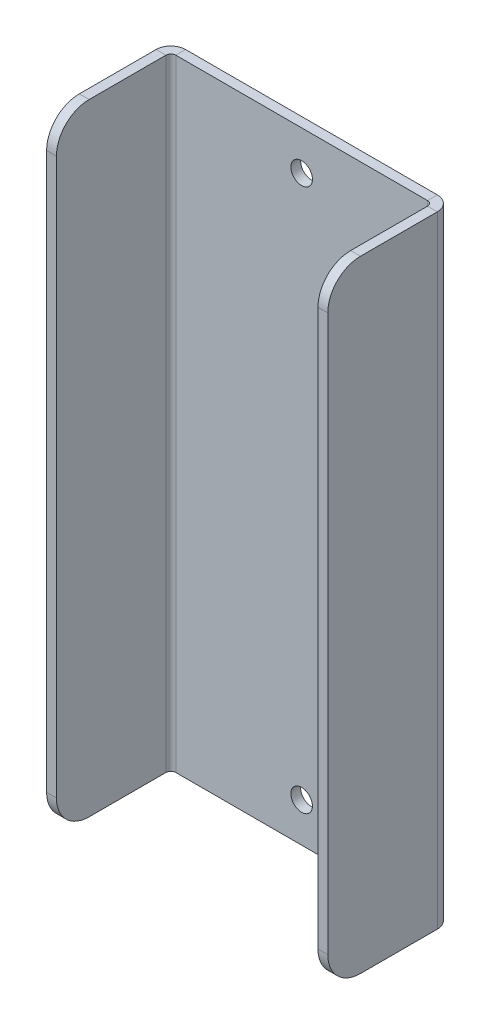
ISO-10303-21;
HEADER;
FILE_DESCRIPTION(('STEP AP214'),'2;1');
FILE_NAME('part.step','',(''),(''),'','','');
FILE_SCHEMA(('AUTOMOTIVE_DESIGN { 1 0 10303 214 1 1 1 1 }'));
ENDSEC;
DATA;
#1=APPLICATION_CONTEXT('core data for automotive mechanical design processes');
#2=APPLICATION_PROTOCOL_DEFINITION('international standard','automotive_design',2000,#1);
#3=PRODUCT_CONTEXT('',#1,'mechanical');
#4=PRODUCT('Part','Part','',(#3));
#5=PRODUCT_RELATED_PRODUCT_CATEGORY('part','',(#4));
#6=PRODUCT_DEFINITION_FORMATION('','',#4);
#7=PRODUCT_DEFINITION_CONTEXT('part definition',#1,'design');
#8=PRODUCT_DEFINITION('design','',#6,#7);
#9=PRODUCT_DEFINITION_SHAPE('','',#8);
#10=(LENGTH_UNIT() NAMED_UNIT(*) SI_UNIT(.MILLI.,.METRE.));
#11=(NAMED_UNIT(*) PLANE_ANGLE_UNIT() SI_UNIT($,.RADIAN.));
#12=(NAMED_UNIT(*) SI_UNIT($,.STERADIAN.) SOLID_ANGLE_UNIT());
#13=UNCERTAINTY_MEASURE_WITH_UNIT(LENGTH_MEASURE(1.E-05),#10,'distance_accuracy_value','');
#14=(GEOMETRIC_REPRESENTATION_CONTEXT(3) GLOBAL_UNCERTAINTY_ASSIGNED_CONTEXT((#13)) GLOBAL_UNIT_ASSIGNED_CONTEXT((#10,
#11,#12)) REPRESENTATION_CONTEXT('',''));
#15=CARTESIAN_POINT('',(0.,0.,0.));
#16=DIRECTION('',(0.,0.,1.));
#17=DIRECTION('',(1.,0.,0.));
#18=AXIS2_PLACEMENT_3D('',#15,#16,#17);
#19=CARTESIAN_POINT('',(0.,0.,-3.));
#20=DIRECTION('',(0.,0.,1.));
#21=DIRECTION('',(1.,0.,0.));
#22=AXIS2_PLACEMENT_3D('',#19,#20,#21);
#23=PLANE('',#22);
#24=CARTESIAN_POINT('',(0.,83.,-3.));
#25=DIRECTION('',(0.,0.,1.));
#26=DIRECTION('',(1.,0.,0.));
#27=AXIS2_PLACEMENT_3D('',#24,#25,#26);
#28=CIRCLE('',#27,3.29999999999991);
#29=CARTESIAN_POINT('',(3.29999999999991,83.,-3.));
#30=VERTEX_POINT('',#29);
#31=EDGE_CURVE('E454',#30,#30,#28,.T.);
#32=ORIENTED_EDGE('',*,*,#31,.T.);
#33=EDGE_LOOP('',(#32));
#34=FACE_BOUND('',#33,.T.);
#35=CARTESIAN_POINT('',(0.,-83.,-3.));
#36=DIRECTION('',(0.,0.,1.));
#37=DIRECTION('',(1.,0.,0.));
#38=AXIS2_PLACEMENT_3D('',#35,#36,#37);
#39=CIRCLE('',#38,3.29999999999991);
#40=CARTESIAN_POINT('',(3.29999999999993,-83.,-3.));
#41=VERTEX_POINT('',#40);
#42=EDGE_CURVE('E445',#41,#41,#39,.T.);
#43=ORIENTED_EDGE('',*,*,#42,.T.);
#44=EDGE_LOOP('',(#43));
#45=FACE_BOUND('',#44,.T.);
#46=DIRECTION('',(0.,1.,0.));
#47=VECTOR('',#46,1.);
#48=CARTESIAN_POINT('',(38.5,95.,-3.00000000000001));
#49=LINE('',#48,#47);
#50=CARTESIAN_POINT('',(38.5,95.,-3.00000000000001));
#51=VERTEX_POINT('',#50);
#52=CARTESIAN_POINT('',(38.5,-95.,-3.));
#53=VERTEX_POINT('',#52);
#54=EDGE_CURVE('E162',#51,#53,#49,.F.);
#55=ORIENTED_EDGE('',*,*,#54,.T.);
#56=DIRECTION('',(1.,0.,0.));
#57=VECTOR('',#56,1.);
#58=CARTESIAN_POINT('',(-40.,-95.,-3.));
#59=LINE('',#58,#57);
#60=CARTESIAN_POINT('',(-38.5,-95.,-2.99999999999999));
#61=VERTEX_POINT('',#60);
#62=EDGE_CURVE('E262',#61,#53,#59,.T.);
#63=ORIENTED_EDGE('',*,*,#62,.F.);
#64=DIRECTION('',(0.,-1.,0.));
#65=VECTOR('',#64,1.);
#66=CARTESIAN_POINT('',(-38.5,-95.,-2.99999999999999));
#67=LINE('',#66,#65);
#68=CARTESIAN_POINT('',(-38.5,95.,-3.));
#69=VERTEX_POINT('',#68);
#70=EDGE_CURVE('E238',#61,#69,#67,.F.);
#71=ORIENTED_EDGE('',*,*,#70,.T.);
#72=DIRECTION('',(-1.,0.,0.));
#73=VECTOR('',#72,1.);
#74=CARTESIAN_POINT('',(-40.,95.,-3.));
#75=LINE('',#74,#73);
#76=EDGE_CURVE('E265',#51,#69,#75,.T.);
#77=ORIENTED_EDGE('',*,*,#76,.F.);
#78=EDGE_LOOP('',(#55,#63,#71,#77));
#79=FACE_BOUND('',#78,.T.);
#80=ADVANCED_FACE('F39',(#34,#45,#79),#23,.F.);
#81=CARTESIAN_POINT('',(0.,0.,0.));
#82=DIRECTION('',(0.,0.,1.));
#83=DIRECTION('',(1.,0.,0.));
#84=AXIS2_PLACEMENT_3D('',#81,#82,#83);
#85=PLANE('',#84);
#86=CARTESIAN_POINT('',(0.,83.,0.));
#87=DIRECTION('',(0.,0.,1.));
#88=DIRECTION('',(1.,0.,0.));
#89=AXIS2_PLACEMENT_3D('',#86,#87,#88);
#90=CIRCLE('',#89,3.29999999999994);
#91=CARTESIAN_POINT('',(3.29999999999994,83.,0.));
#92=VERTEX_POINT('',#91);
#93=EDGE_CURVE('E456',#92,#92,#90,.T.);
#94=ORIENTED_EDGE('',*,*,#93,.F.);
#95=EDGE_LOOP('',(#94));
#96=FACE_BOUND('',#95,.T.);
#97=CARTESIAN_POINT('',(0.,-83.,0.));
#98=DIRECTION('',(0.,0.,1.));
#99=DIRECTION('',(1.,0.,0.));
#100=AXIS2_PLACEMENT_3D('',#97,#98,#99);
#101=CIRCLE('',#100,3.29999999999994);
#102=CARTESIAN_POINT('',(3.29999999999996,-83.,0.));
#103=VERTEX_POINT('',#102);
#104=EDGE_CURVE('E449',#103,#103,#101,.T.);
#105=ORIENTED_EDGE('',*,*,#104,.F.);
#106=EDGE_LOOP('',(#105));
#107=FACE_BOUND('',#106,.T.);
#108=DIRECTION('',(1.,0.,0.));
#109=VECTOR('',#108,1.);
#110=CARTESIAN_POINT('',(-40.,-95.,0.));
#111=LINE('',#110,#109);
#112=CARTESIAN_POINT('',(-38.5,-95.,0.));
#113=VERTEX_POINT('',#112);
#114=CARTESIAN_POINT('',(38.5,-95.,0.));
#115=VERTEX_POINT('',#114);
#116=EDGE_CURVE('E259',#113,#115,#111,.T.);
#117=ORIENTED_EDGE('',*,*,#116,.T.);
#118=DIRECTION('',(0.,1.,0.));
#119=VECTOR('',#118,1.);
#120=CARTESIAN_POINT('',(38.5,95.,0.));
#121=LINE('',#120,#119);
#122=CARTESIAN_POINT('',(38.5,95.,0.));
#123=VERTEX_POINT('',#122);
#124=EDGE_CURVE('E201',#123,#115,#121,.F.);
#125=ORIENTED_EDGE('',*,*,#124,.F.);
#126=DIRECTION('',(-1.,0.,0.));
#127=VECTOR('',#126,1.);
#128=CARTESIAN_POINT('',(-40.,95.,0.));
#129=LINE('',#128,#127);
#130=CARTESIAN_POINT('',(-38.5,95.,0.));
#131=VERTEX_POINT('',#130);
#132=EDGE_CURVE('E266',#123,#131,#129,.T.);
#133=ORIENTED_EDGE('',*,*,#132,.T.);
#134=DIRECTION('',(0.,-1.,0.));
#135=VECTOR('',#134,1.);
#136=CARTESIAN_POINT('',(-38.5,-95.,0.));
#137=LINE('',#136,#135);
#138=EDGE_CURVE('E251',#113,#131,#137,.F.);
#139=ORIENTED_EDGE('',*,*,#138,.F.);
#140=EDGE_LOOP('',(#117,#125,#133,#139));
#141=FACE_BOUND('',#140,.T.);
#142=ADVANCED_FACE('F348',(#96,#107,#141),#85,.T.);
#143=CARTESIAN_POINT('',(-40.,95.,-3.));
#144=DIRECTION('',(0.,1.,0.));
#145=DIRECTION('',(0.,0.,1.));
#146=AXIS2_PLACEMENT_3D('',#143,#144,#145);
#147=PLANE('',#146);
#148=ORIENTED_EDGE('',*,*,#132,.F.);
#149=DIRECTION('',(0.,0.,-1.));
#150=VECTOR('',#149,1.);
#151=CARTESIAN_POINT('',(38.5,95.,0.));
#152=LINE('',#151,#150);
#153=EDGE_CURVE('E197',#123,#51,#152,.T.);
#154=ORIENTED_EDGE('',*,*,#153,.T.);
#155=ORIENTED_EDGE('',*,*,#76,.T.);
#156=DIRECTION('',(0.,0.,-1.));
#157=VECTOR('',#156,1.);
#158=CARTESIAN_POINT('',(-38.5,95.,0.));
#159=LINE('',#158,#157);
#160=EDGE_CURVE('E256',#131,#69,#159,.T.);
#161=ORIENTED_EDGE('',*,*,#160,.F.);
#162=EDGE_LOOP('',(#148,#154,#155,#161));
#163=FACE_BOUND('',#162,.T.);
#164=ADVANCED_FACE('F354',(#163),#147,.T.);
#165=CARTESIAN_POINT('',(-40.,-95.,-3.));
#166=DIRECTION('',(0.,-1.,0.));
#167=DIRECTION('',(0.,0.,-1.));
#168=AXIS2_PLACEMENT_3D('',#165,#166,#167);
#169=PLANE('',#168);
#170=DIRECTION('',(0.,0.,-1.));
#171=VECTOR('',#170,1.);
#172=CARTESIAN_POINT('',(38.5,-95.,0.));
#173=LINE('',#172,#171);
#174=EDGE_CURVE('E205',#115,#53,#173,.T.);
#175=ORIENTED_EDGE('',*,*,#174,.F.);
#176=ORIENTED_EDGE('',*,*,#116,.F.);
#177=DIRECTION('',(0.,0.,-1.));
#178=VECTOR('',#177,1.);
#179=CARTESIAN_POINT('',(-38.5,-95.,0.));
#180=LINE('',#179,#178);
#181=EDGE_CURVE('E245',#113,#61,#180,.T.);
#182=ORIENTED_EDGE('',*,*,#181,.T.);
#183=ORIENTED_EDGE('',*,*,#62,.T.);
#184=EDGE_LOOP('',(#175,#176,#182,#183));
#185=FACE_BOUND('',#184,.T.);
#186=ADVANCED_FACE('F364',(#185),#169,.T.);
#187=CARTESIAN_POINT('',(-38.5,95.,1.5));
#188=DIRECTION('',(0.,1.,0.));
#189=DIRECTION('',(0.,0.,1.));
#190=AXIS2_PLACEMENT_3D('',#187,#188,#189);
#191=PLANE('',#190);
#192=DIRECTION('',(-1.,0.,0.));
#193=VECTOR('',#192,1.);
#194=CARTESIAN_POINT('',(-40.,95.,1.49999999999999));
#195=LINE('',#194,#193);
#196=CARTESIAN_POINT('',(-40.,95.,1.49999999999999));
#197=VERTEX_POINT('',#196);
#198=CARTESIAN_POINT('',(-43.,95.,1.49999999999998));
#199=VERTEX_POINT('',#198);
#200=EDGE_CURVE('E208',#197,#199,#195,.T.);
#201=ORIENTED_EDGE('',*,*,#200,.F.);
#202=CARTESIAN_POINT('',(-38.5,95.,1.5));
#203=DIRECTION('',(0.,-1.,0.));
#204=DIRECTION('',(0.,0.,-1.));
#205=AXIS2_PLACEMENT_3D('',#202,#203,#204);
#206=CIRCLE('',#205,1.5);
#207=EDGE_CURVE('E248',#131,#197,#206,.F.);
#208=ORIENTED_EDGE('',*,*,#207,.F.);
#209=ORIENTED_EDGE('',*,*,#160,.T.);
#210=CARTESIAN_POINT('',(-38.5,95.,1.5));
#211=DIRECTION('',(0.,-1.,0.));
#212=DIRECTION('',(0.,0.,-1.));
#213=AXIS2_PLACEMENT_3D('',#210,#211,#212);
#214=CIRCLE('',#213,4.5);
#215=EDGE_CURVE('E241',#69,#199,#214,.F.);
#216=ORIENTED_EDGE('',*,*,#215,.T.);
#217=EDGE_LOOP('',(#201,#208,#209,#216));
#218=FACE_BOUND('',#217,.T.);
#219=ADVANCED_FACE('F368',(#218),#191,.T.);
#220=CARTESIAN_POINT('',(-38.5,-95.,1.50000000000001));
#221=DIRECTION('',(0.,1.,0.));
#222=DIRECTION('',(0.,0.,1.));
#223=AXIS2_PLACEMENT_3D('',#220,#221,#222);
#224=PLANE('',#223);
#225=CARTESIAN_POINT('',(-38.5,-95.,1.50000000000001));
#226=DIRECTION('',(0.,-1.,0.));
#227=DIRECTION('',(0.,0.,-1.));
#228=AXIS2_PLACEMENT_3D('',#225,#226,#227);
#229=CIRCLE('',#228,1.5);
#230=CARTESIAN_POINT('',(-40.,-95.,1.5));
#231=VERTEX_POINT('',#230);
#232=EDGE_CURVE('E231',#231,#113,#229,.T.);
#233=ORIENTED_EDGE('',*,*,#232,.F.);
#234=DIRECTION('',(-1.,0.,0.));
#235=VECTOR('',#234,1.);
#236=CARTESIAN_POINT('',(-40.,-95.,1.5));
#237=LINE('',#236,#235);
#238=CARTESIAN_POINT('',(-43.,-95.,1.49999999999999));
#239=VERTEX_POINT('',#238);
#240=EDGE_CURVE('E213',#231,#239,#237,.T.);
#241=ORIENTED_EDGE('',*,*,#240,.T.);
#242=CARTESIAN_POINT('',(-38.5,-95.,1.50000000000001));
#243=DIRECTION('',(0.,-1.,0.));
#244=DIRECTION('',(0.,0.,-1.));
#245=AXIS2_PLACEMENT_3D('',#242,#243,#244);
#246=CIRCLE('',#245,4.5);
#247=EDGE_CURVE('E242',#239,#61,#246,.T.);
#248=ORIENTED_EDGE('',*,*,#247,.T.);
#249=ORIENTED_EDGE('',*,*,#181,.F.);
#250=EDGE_LOOP('',(#233,#241,#248,#249));
#251=FACE_BOUND('',#250,.T.);
#252=ADVANCED_FACE('F321',(#251),#224,.F.);
#253=CARTESIAN_POINT('',(-38.5,-95.,1.50000000000001));
#254=DIRECTION('',(0.,-1.,0.));
#255=DIRECTION('',(-1.,0.,0.));
#256=AXIS2_PLACEMENT_3D('',#253,#254,#255);
#257=CYLINDRICAL_SURFACE('',#256,4.5);
#258=ORIENTED_EDGE('',*,*,#70,.F.);
#259=ORIENTED_EDGE('',*,*,#247,.F.);
#260=DIRECTION('',(0.,1.,0.));
#261=VECTOR('',#260,1.);
#262=CARTESIAN_POINT('',(-43.,0.,1.49999999999999));
#263=LINE('',#262,#261);
#264=EDGE_CURVE('E216',#239,#199,#263,.T.);
#265=ORIENTED_EDGE('',*,*,#264,.T.);
#266=ORIENTED_EDGE('',*,*,#215,.F.);
#267=EDGE_LOOP('',(#258,#259,#265,#266));
#268=FACE_BOUND('',#267,.T.);
#269=ADVANCED_FACE('F423',(#268),#257,.T.);
#270=CARTESIAN_POINT('',(-38.5,-95.,1.50000000000001));
#271=DIRECTION('',(0.,-1.,0.));
#272=DIRECTION('',(-1.,0.,0.));
#273=AXIS2_PLACEMENT_3D('',#270,#271,#272);
#274=CYLINDRICAL_SURFACE('',#273,1.5);
#275=ORIENTED_EDGE('',*,*,#138,.T.);
#276=ORIENTED_EDGE('',*,*,#207,.T.);
#277=DIRECTION('',(0.,-1.,0.));
#278=VECTOR('',#277,1.);
#279=CARTESIAN_POINT('',(-40.,95.,1.49999999999999));
#280=LINE('',#279,#278);
#281=EDGE_CURVE('E211',#197,#231,#280,.T.);
#282=ORIENTED_EDGE('',*,*,#281,.T.);
#283=ORIENTED_EDGE('',*,*,#232,.T.);
#284=EDGE_LOOP('',(#275,#276,#282,#283));
#285=FACE_BOUND('',#284,.T.);
#286=ADVANCED_FACE('F316',(#285),#274,.F.);
#287=CARTESIAN_POINT('',(-43.,95.,0.));
#288=DIRECTION('',(0.,-1.,0.));
#289=DIRECTION('',(1.,0.,0.));
#290=AXIS2_PLACEMENT_3D('',#287,#288,#289);
#291=PLANE('',#290);
#292=DIRECTION('',(0.,0.,-1.));
#293=VECTOR('',#292,1.);
#294=CARTESIAN_POINT('',(-43.,95.,0.));
#295=LINE('',#294,#293);
#296=CARTESIAN_POINT('',(-43.0000000000001,95.,25.));
#297=VERTEX_POINT('',#296);
#298=EDGE_CURVE('E222',#297,#199,#295,.T.);
#299=ORIENTED_EDGE('',*,*,#298,.F.);
#300=DIRECTION('',(1.,0.,0.));
#301=VECTOR('',#300,1.);
#302=CARTESIAN_POINT('',(-43.0000000000001,95.,25.));
#303=LINE('',#302,#301);
#304=CARTESIAN_POINT('',(-40.0000000000001,95.,25.));
#305=VERTEX_POINT('',#304);
#306=EDGE_CURVE('E47',#297,#305,#303,.T.);
#307=ORIENTED_EDGE('',*,*,#306,.T.);
#308=DIRECTION('',(0.,0.,-1.));
#309=VECTOR('',#308,1.);
#310=CARTESIAN_POINT('',(-40.,95.,0.));
#311=LINE('',#310,#309);
#312=EDGE_CURVE('E221',#305,#197,#311,.T.);
#313=ORIENTED_EDGE('',*,*,#312,.T.);
#314=ORIENTED_EDGE('',*,*,#200,.T.);
#315=EDGE_LOOP('',(#299,#307,#313,#314));
#316=FACE_BOUND('',#315,.T.);
#317=ADVANCED_FACE('F305',(#316),#291,.F.);
#318=CARTESIAN_POINT('',(-43.0000000000001,-95.,35.));
#319=DIRECTION('',(0.,1.,0.));
#320=DIRECTION('',(-1.,0.,0.));
#321=AXIS2_PLACEMENT_3D('',#318,#319,#320);
#322=PLANE('',#321);
#323=DIRECTION('',(0.,0.,1.));
#324=VECTOR('',#323,1.);
#325=CARTESIAN_POINT('',(-40.0000000000001,-95.,35.));
#326=LINE('',#325,#324);
#327=CARTESIAN_POINT('',(-40.0000000000001,-95.,25.));
#328=VERTEX_POINT('',#327);
#329=EDGE_CURVE('E233',#231,#328,#326,.T.);
#330=ORIENTED_EDGE('',*,*,#329,.T.);
#331=DIRECTION('',(1.,0.,0.));
#332=VECTOR('',#331,1.);
#333=CARTESIAN_POINT('',(-43.0000000000001,-95.,25.));
#334=LINE('',#333,#332);
#335=CARTESIAN_POINT('',(-43.0000000000001,-95.,25.));
#336=VERTEX_POINT('',#335);
#337=EDGE_CURVE('E280',#328,#336,#334,.F.);
#338=ORIENTED_EDGE('',*,*,#337,.T.);
#339=DIRECTION('',(0.,0.,1.));
#340=VECTOR('',#339,1.);
#341=CARTESIAN_POINT('',(-43.0000000000001,-95.,35.));
#342=LINE('',#341,#340);
#343=EDGE_CURVE('E224',#239,#336,#342,.T.);
#344=ORIENTED_EDGE('',*,*,#343,.F.);
#345=ORIENTED_EDGE('',*,*,#240,.F.);
#346=EDGE_LOOP('',(#330,#338,#344,#345));
#347=FACE_BOUND('',#346,.T.);
#348=ADVANCED_FACE('F325',(#347),#322,.F.);
#349=CARTESIAN_POINT('',(-43.,0.,-1.4528723986387E-13));
#350=DIRECTION('',(1.,0.,0.));
#351=DIRECTION('',(0.,0.,-1.));
#352=AXIS2_PLACEMENT_3D('',#349,#350,#351);
#353=PLANE('',#352);
#354=ORIENTED_EDGE('',*,*,#343,.T.);
#355=CARTESIAN_POINT('',(-43.0000000000001,-85.,25.));
#356=DIRECTION('',(1.,0.,0.));
#357=DIRECTION('',(0.,0.,-1.));
#358=AXIS2_PLACEMENT_3D('',#355,#356,#357);
#359=CIRCLE('',#358,10.);
#360=CARTESIAN_POINT('',(-43.0000000000001,-85.,35.));
#361=VERTEX_POINT('',#360);
#362=EDGE_CURVE('E284',#336,#361,#359,.F.);
#363=ORIENTED_EDGE('',*,*,#362,.T.);
#364=DIRECTION('',(0.,1.,0.));
#365=VECTOR('',#364,1.);
#366=CARTESIAN_POINT('',(-43.0000000000001,95.,35.));
#367=LINE('',#366,#365);
#368=CARTESIAN_POINT('',(-43.0000000000001,85.,35.));
#369=VERTEX_POINT('',#368);
#370=EDGE_CURVE('E228',#361,#369,#367,.T.);
#371=ORIENTED_EDGE('',*,*,#370,.T.);
#372=CARTESIAN_POINT('',(-43.0000000000001,85.,25.));
#373=DIRECTION('',(1.,0.,0.));
#374=DIRECTION('',(0.,0.,-1.));
#375=AXIS2_PLACEMENT_3D('',#372,#373,#374);
#376=CIRCLE('',#375,10.);
#377=EDGE_CURVE('E282',#369,#297,#376,.F.);
#378=ORIENTED_EDGE('',*,*,#377,.T.);
#379=ORIENTED_EDGE('',*,*,#298,.T.);
#380=ORIENTED_EDGE('',*,*,#264,.F.);
#381=EDGE_LOOP('',(#354,#363,#371,#378,#379,#380));
#382=FACE_BOUND('',#381,.T.);
#383=ADVANCED_FACE('F329',(#382),#353,.F.);
#384=CARTESIAN_POINT('',(-40.,0.,-1.3481279584734E-13));
#385=DIRECTION('',(1.,0.,0.));
#386=DIRECTION('',(0.,0.,-1.));
#387=AXIS2_PLACEMENT_3D('',#384,#385,#386);
#388=PLANE('',#387);
#389=DIRECTION('',(0.,1.,0.));
#390=VECTOR('',#389,1.);
#391=CARTESIAN_POINT('',(-40.0000000000001,95.,35.));
#392=LINE('',#391,#390);
#393=CARTESIAN_POINT('',(-40.0000000000001,-85.,35.));
#394=VERTEX_POINT('',#393);
#395=CARTESIAN_POINT('',(-40.0000000000001,85.,35.));
#396=VERTEX_POINT('',#395);
#397=EDGE_CURVE('E225',#394,#396,#392,.T.);
#398=ORIENTED_EDGE('',*,*,#397,.F.);
#399=CARTESIAN_POINT('',(-40.0000000000001,-85.,25.));
#400=DIRECTION('',(1.,0.,0.));
#401=DIRECTION('',(0.,0.,-1.));
#402=AXIS2_PLACEMENT_3D('',#399,#400,#401);
#403=CIRCLE('',#402,10.);
#404=EDGE_CURVE('E278',#394,#328,#403,.T.);
#405=ORIENTED_EDGE('',*,*,#404,.T.);
#406=ORIENTED_EDGE('',*,*,#329,.F.);
#407=ORIENTED_EDGE('',*,*,#281,.F.);
#408=ORIENTED_EDGE('',*,*,#312,.F.);
#409=CARTESIAN_POINT('',(-40.0000000000001,85.,25.));
#410=DIRECTION('',(1.,0.,0.));
#411=DIRECTION('',(0.,0.,-1.));
#412=AXIS2_PLACEMENT_3D('',#409,#410,#411);
#413=CIRCLE('',#412,10.);
#414=EDGE_CURVE('E276',#305,#396,#413,.T.);
#415=ORIENTED_EDGE('',*,*,#414,.T.);
#416=EDGE_LOOP('',(#398,#405,#406,#407,#408,#415));
#417=FACE_BOUND('',#416,.T.);
#418=ADVANCED_FACE('F312',(#417),#388,.T.);
#419=CARTESIAN_POINT('',(-43.0000000000001,95.,35.));
#420=DIRECTION('',(0.,0.,-1.));
#421=DIRECTION('',(-1.,0.,0.));
#422=AXIS2_PLACEMENT_3D('',#419,#420,#421);
#423=PLANE('',#422);
#424=ORIENTED_EDGE('',*,*,#370,.F.);
#425=DIRECTION('',(1.,0.,0.));
#426=VECTOR('',#425,1.);
#427=CARTESIAN_POINT('',(-43.0000000000001,-85.,35.));
#428=LINE('',#427,#426);
#429=EDGE_CURVE('E273',#361,#394,#428,.T.);
#430=ORIENTED_EDGE('',*,*,#429,.T.);
#431=ORIENTED_EDGE('',*,*,#397,.T.);
#432=DIRECTION('',(1.,0.,0.));
#433=VECTOR('',#432,1.);
#434=CARTESIAN_POINT('',(-43.0000000000001,85.,35.));
#435=LINE('',#434,#433);
#436=EDGE_CURVE('E268',#396,#369,#435,.F.);
#437=ORIENTED_EDGE('',*,*,#436,.T.);
#438=EDGE_LOOP('',(#424,#430,#431,#437));
#439=FACE_BOUND('',#438,.T.);
#440=ADVANCED_FACE('F335',(#439),#423,.F.);
#441=CARTESIAN_POINT('',(38.5,-95.,1.5));
#442=DIRECTION('',(0.,-1.,0.));
#443=DIRECTION('',(0.,0.,-1.));
#444=AXIS2_PLACEMENT_3D('',#441,#442,#443);
#445=PLANE('',#444);
#446=DIRECTION('',(1.,0.,0.));
#447=VECTOR('',#446,1.);
#448=CARTESIAN_POINT('',(40.,-95.,1.49999999999999));
#449=LINE('',#448,#447);
#450=CARTESIAN_POINT('',(40.,-95.,1.49999999999999));
#451=VERTEX_POINT('',#450);
#452=CARTESIAN_POINT('',(43.,-95.,1.49999999999998));
#453=VERTEX_POINT('',#452);
#454=EDGE_CURVE('E444',#451,#453,#449,.T.);
#455=ORIENTED_EDGE('',*,*,#454,.F.);
#456=CARTESIAN_POINT('',(38.5,-95.,1.5));
#457=DIRECTION('',(0.,1.,0.));
#458=DIRECTION('',(0.,0.,1.));
#459=AXIS2_PLACEMENT_3D('',#456,#457,#458);
#460=CIRCLE('',#459,1.5);
#461=EDGE_CURVE('E165',#115,#451,#460,.F.);
#462=ORIENTED_EDGE('',*,*,#461,.F.);
#463=ORIENTED_EDGE('',*,*,#174,.T.);
#464=CARTESIAN_POINT('',(38.5,-95.,1.5));
#465=DIRECTION('',(0.,1.,0.));
#466=DIRECTION('',(0.,0.,1.));
#467=AXIS2_PLACEMENT_3D('',#464,#465,#466);
#468=CIRCLE('',#467,4.5);
#469=EDGE_CURVE('E196',#53,#453,#468,.F.);
#470=ORIENTED_EDGE('',*,*,#469,.T.);
#471=EDGE_LOOP('',(#455,#462,#463,#470));
#472=FACE_BOUND('',#471,.T.);
#473=ADVANCED_FACE('F407',(#472),#445,.T.);
#474=CARTESIAN_POINT('',(38.5,95.,1.5));
#475=DIRECTION('',(0.,-1.,0.));
#476=DIRECTION('',(0.,0.,-1.));
#477=AXIS2_PLACEMENT_3D('',#474,#475,#476);
#478=PLANE('',#477);
#479=CARTESIAN_POINT('',(38.5,95.,1.5));
#480=DIRECTION('',(0.,1.,0.));
#481=DIRECTION('',(0.,0.,1.));
#482=AXIS2_PLACEMENT_3D('',#479,#480,#481);
#483=CIRCLE('',#482,1.5);
#484=CARTESIAN_POINT('',(40.,95.,1.49999999999999));
#485=VERTEX_POINT('',#484);
#486=EDGE_CURVE('E172',#485,#123,#483,.T.);
#487=ORIENTED_EDGE('',*,*,#486,.F.);
#488=DIRECTION('',(1.,0.,0.));
#489=VECTOR('',#488,1.);
#490=CARTESIAN_POINT('',(40.,95.,1.49999999999999));
#491=LINE('',#490,#489);
#492=CARTESIAN_POINT('',(43.,95.,1.49999999999998));
#493=VERTEX_POINT('',#492);
#494=EDGE_CURVE('E169',#485,#493,#491,.T.);
#495=ORIENTED_EDGE('',*,*,#494,.T.);
#496=CARTESIAN_POINT('',(38.5,95.,1.5));
#497=DIRECTION('',(0.,1.,0.));
#498=DIRECTION('',(0.,0.,1.));
#499=AXIS2_PLACEMENT_3D('',#496,#497,#498);
#500=CIRCLE('',#499,4.5);
#501=EDGE_CURVE('E155',#493,#51,#500,.T.);
#502=ORIENTED_EDGE('',*,*,#501,.T.);
#503=ORIENTED_EDGE('',*,*,#153,.F.);
#504=EDGE_LOOP('',(#487,#495,#502,#503));
#505=FACE_BOUND('',#504,.T.);
#506=ADVANCED_FACE('F170',(#505),#478,.F.);
#507=CARTESIAN_POINT('',(38.5,95.,1.5));
#508=DIRECTION('',(0.,1.,0.));
#509=DIRECTION('',(1.,0.,0.));
#510=AXIS2_PLACEMENT_3D('',#507,#508,#509);
#511=CYLINDRICAL_SURFACE('',#510,4.5);
#512=ORIENTED_EDGE('',*,*,#54,.F.);
#513=ORIENTED_EDGE('',*,*,#501,.F.);
#514=DIRECTION('',(0.,-1.,0.));
#515=VECTOR('',#514,1.);
#516=CARTESIAN_POINT('',(43.,0.,1.49999999999998));
#517=LINE('',#516,#515);
#518=EDGE_CURVE('E160',#493,#453,#517,.T.);
#519=ORIENTED_EDGE('',*,*,#518,.T.);
#520=ORIENTED_EDGE('',*,*,#469,.F.);
#521=EDGE_LOOP('',(#512,#513,#519,#520));
#522=FACE_BOUND('',#521,.T.);
#523=ADVANCED_FACE('F157',(#522),#511,.T.);
#524=CARTESIAN_POINT('',(38.5,95.,1.5));
#525=DIRECTION('',(0.,1.,0.));
#526=DIRECTION('',(1.,0.,0.));
#527=AXIS2_PLACEMENT_3D('',#524,#525,#526);
#528=CYLINDRICAL_SURFACE('',#527,1.5);
#529=ORIENTED_EDGE('',*,*,#124,.T.);
#530=ORIENTED_EDGE('',*,*,#461,.T.);
#531=DIRECTION('',(0.,1.,0.));
#532=VECTOR('',#531,1.);
#533=CARTESIAN_POINT('',(40.,-95.,1.49999999999999));
#534=LINE('',#533,#532);
#535=EDGE_CURVE('E174',#451,#485,#534,.T.);
#536=ORIENTED_EDGE('',*,*,#535,.T.);
#537=ORIENTED_EDGE('',*,*,#486,.T.);
#538=EDGE_LOOP('',(#529,#530,#536,#537));
#539=FACE_BOUND('',#538,.T.);
#540=ADVANCED_FACE('F400',(#539),#528,.F.);
#541=CARTESIAN_POINT('',(43.,-95.,0.));
#542=DIRECTION('',(0.,1.,0.));
#543=DIRECTION('',(-1.,0.,0.));
#544=AXIS2_PLACEMENT_3D('',#541,#542,#543);
#545=PLANE('',#544);
#546=DIRECTION('',(0.,0.,-1.));
#547=VECTOR('',#546,1.);
#548=CARTESIAN_POINT('',(43.,-95.,0.));
#549=LINE('',#548,#547);
#550=CARTESIAN_POINT('',(43.0000000000001,-95.,25.));
#551=VERTEX_POINT('',#550);
#552=EDGE_CURVE('E181',#551,#453,#549,.T.);
#553=ORIENTED_EDGE('',*,*,#552,.F.);
#554=DIRECTION('',(-1.,0.,0.));
#555=VECTOR('',#554,1.);
#556=CARTESIAN_POINT('',(43.0000000000001,-95.,25.));
#557=LINE('',#556,#555);
#558=CARTESIAN_POINT('',(40.0000000000001,-95.,25.));
#559=VERTEX_POINT('',#558);
#560=EDGE_CURVE('E286',#551,#559,#557,.T.);
#561=ORIENTED_EDGE('',*,*,#560,.T.);
#562=DIRECTION('',(0.,0.,-1.));
#563=VECTOR('',#562,1.);
#564=CARTESIAN_POINT('',(40.,-95.,0.));
#565=LINE('',#564,#563);
#566=EDGE_CURVE('E182',#559,#451,#565,.T.);
#567=ORIENTED_EDGE('',*,*,#566,.T.);
#568=ORIENTED_EDGE('',*,*,#454,.T.);
#569=EDGE_LOOP('',(#553,#561,#567,#568));
#570=FACE_BOUND('',#569,.T.);
#571=ADVANCED_FACE('F397',(#570),#545,.F.);
#572=CARTESIAN_POINT('',(43.0000000000001,95.,35.));
#573=DIRECTION('',(0.,-1.,0.));
#574=DIRECTION('',(1.,0.,0.));
#575=AXIS2_PLACEMENT_3D('',#572,#573,#574);
#576=PLANE('',#575);
#577=DIRECTION('',(0.,0.,1.));
#578=VECTOR('',#577,1.);
#579=CARTESIAN_POINT('',(40.0000000000001,95.,35.));
#580=LINE('',#579,#578);
#581=CARTESIAN_POINT('',(40.0000000000001,95.,25.));
#582=VERTEX_POINT('',#581);
#583=EDGE_CURVE('E192',#485,#582,#580,.T.);
#584=ORIENTED_EDGE('',*,*,#583,.T.);
#585=DIRECTION('',(-1.,0.,0.));
#586=VECTOR('',#585,1.);
#587=CARTESIAN_POINT('',(43.0000000000001,95.,25.));
#588=LINE('',#587,#586);
#589=CARTESIAN_POINT('',(43.0000000000001,95.,25.));
#590=VERTEX_POINT('',#589);
#591=EDGE_CURVE('E11',#582,#590,#588,.F.);
#592=ORIENTED_EDGE('',*,*,#591,.T.);
#593=DIRECTION('',(0.,0.,1.));
#594=VECTOR('',#593,1.);
#595=CARTESIAN_POINT('',(43.0000000000001,95.,35.));
#596=LINE('',#595,#594);
#597=EDGE_CURVE('E178',#493,#590,#596,.T.);
#598=ORIENTED_EDGE('',*,*,#597,.F.);
#599=ORIENTED_EDGE('',*,*,#494,.F.);
#600=EDGE_LOOP('',(#584,#592,#598,#599));
#601=FACE_BOUND('',#600,.T.);
#602=ADVANCED_FACE('F184',(#601),#576,.F.);
#603=CARTESIAN_POINT('',(43.,0.,-1.53217404325478E-13));
#604=DIRECTION('',(-1.,0.,0.));
#605=DIRECTION('',(0.,0.,1.));
#606=AXIS2_PLACEMENT_3D('',#603,#604,#605);
#607=PLANE('',#606);
#608=DIRECTION('',(0.,-1.,0.));
#609=VECTOR('',#608,1.);
#610=CARTESIAN_POINT('',(43.0000000000001,-95.,35.));
#611=LINE('',#610,#609);
#612=CARTESIAN_POINT('',(43.0000000000001,85.,35.));
#613=VERTEX_POINT('',#612);
#614=CARTESIAN_POINT('',(43.0000000000001,-85.,35.));
#615=VERTEX_POINT('',#614);
#616=EDGE_CURVE('E185',#613,#615,#611,.T.);
#617=ORIENTED_EDGE('',*,*,#616,.T.);
#618=CARTESIAN_POINT('',(43.0000000000001,-85.,25.));
#619=DIRECTION('',(-1.,0.,0.));
#620=DIRECTION('',(0.,0.,1.));
#621=AXIS2_PLACEMENT_3D('',#618,#619,#620);
#622=CIRCLE('',#621,10.);
#623=EDGE_CURVE('E299',#615,#551,#622,.F.);
#624=ORIENTED_EDGE('',*,*,#623,.T.);
#625=ORIENTED_EDGE('',*,*,#552,.T.);
#626=ORIENTED_EDGE('',*,*,#518,.F.);
#627=ORIENTED_EDGE('',*,*,#597,.T.);
#628=CARTESIAN_POINT('',(43.0000000000001,85.,25.));
#629=DIRECTION('',(-1.,0.,0.));
#630=DIRECTION('',(0.,0.,1.));
#631=AXIS2_PLACEMENT_3D('',#628,#629,#630);
#632=CIRCLE('',#631,10.);
#633=EDGE_CURVE('E297',#590,#613,#632,.F.);
#634=ORIENTED_EDGE('',*,*,#633,.T.);
#635=EDGE_LOOP('',(#617,#624,#625,#626,#627,#634));
#636=FACE_BOUND('',#635,.T.);
#637=ADVANCED_FACE('F177',(#636),#607,.F.);
#638=CARTESIAN_POINT('',(40.,0.,-1.42742960308949E-13));
#639=DIRECTION('',(-1.,0.,0.));
#640=DIRECTION('',(0.,0.,1.));
#641=AXIS2_PLACEMENT_3D('',#638,#639,#640);
#642=PLANE('',#641);
#643=ORIENTED_EDGE('',*,*,#566,.F.);
#644=CARTESIAN_POINT('',(40.0000000000001,-85.,25.));
#645=DIRECTION('',(-1.,0.,0.));
#646=DIRECTION('',(0.,0.,1.));
#647=AXIS2_PLACEMENT_3D('',#644,#645,#646);
#648=CIRCLE('',#647,10.);
#649=CARTESIAN_POINT('',(40.0000000000001,-85.,35.));
#650=VERTEX_POINT('',#649);
#651=EDGE_CURVE('E291',#559,#650,#648,.T.);
#652=ORIENTED_EDGE('',*,*,#651,.T.);
#653=DIRECTION('',(0.,-1.,0.));
#654=VECTOR('',#653,1.);
#655=CARTESIAN_POINT('',(40.0000000000001,-95.,35.));
#656=LINE('',#655,#654);
#657=CARTESIAN_POINT('',(40.0000000000001,85.,35.));
#658=VERTEX_POINT('',#657);
#659=EDGE_CURVE('E188',#658,#650,#656,.T.);
#660=ORIENTED_EDGE('',*,*,#659,.F.);
#661=CARTESIAN_POINT('',(40.0000000000001,85.,25.));
#662=DIRECTION('',(-1.,0.,0.));
#663=DIRECTION('',(0.,0.,1.));
#664=AXIS2_PLACEMENT_3D('',#661,#662,#663);
#665=CIRCLE('',#664,10.);
#666=EDGE_CURVE('E289',#658,#582,#665,.T.);
#667=ORIENTED_EDGE('',*,*,#666,.T.);
#668=ORIENTED_EDGE('',*,*,#583,.F.);
#669=ORIENTED_EDGE('',*,*,#535,.F.);
#670=EDGE_LOOP('',(#643,#652,#660,#667,#668,#669));
#671=FACE_BOUND('',#670,.T.);
#672=ADVANCED_FACE('F389',(#671),#642,.T.);
#673=CARTESIAN_POINT('',(43.0000000000001,-95.,35.));
#674=DIRECTION('',(0.,0.,-1.));
#675=DIRECTION('',(-1.,0.,0.));
#676=AXIS2_PLACEMENT_3D('',#673,#674,#675);
#677=PLANE('',#676);
#678=ORIENTED_EDGE('',*,*,#659,.T.);
#679=DIRECTION('',(-1.,0.,0.));
#680=VECTOR('',#679,1.);
#681=CARTESIAN_POINT('',(43.0000000000001,-85.,35.));
#682=LINE('',#681,#680);
#683=EDGE_CURVE('E60',#650,#615,#682,.F.);
#684=ORIENTED_EDGE('',*,*,#683,.T.);
#685=ORIENTED_EDGE('',*,*,#616,.F.);
#686=DIRECTION('',(-1.,0.,0.));
#687=VECTOR('',#686,1.);
#688=CARTESIAN_POINT('',(43.0000000000001,85.,35.));
#689=LINE('',#688,#687);
#690=EDGE_CURVE('E293',#613,#658,#689,.T.);
#691=ORIENTED_EDGE('',*,*,#690,.T.);
#692=EDGE_LOOP('',(#678,#684,#685,#691));
#693=FACE_BOUND('',#692,.T.);
#694=ADVANCED_FACE('F381',(#693),#677,.F.);
#695=CARTESIAN_POINT('',(0.,-83.,0.));
#696=DIRECTION('',(0.,0.,1.));
#697=DIRECTION('',(1.,0.,0.));
#698=AXIS2_PLACEMENT_3D('',#695,#696,#697);
#699=CYLINDRICAL_SURFACE('',#698,3.29999999999991);
#700=ORIENTED_EDGE('',*,*,#104,.T.);
#701=EDGE_LOOP('',(#700));
#702=FACE_BOUND('',#701,.T.);
#703=ORIENTED_EDGE('',*,*,#42,.F.);
#704=EDGE_LOOP('',(#703));
#705=FACE_BOUND('',#704,.T.);
#706=ADVANCED_FACE('F375',(#702,#705),#699,.F.);
#707=CARTESIAN_POINT('',(0.,83.,0.));
#708=DIRECTION('',(0.,0.,1.));
#709=DIRECTION('',(1.,0.,0.));
#710=AXIS2_PLACEMENT_3D('',#707,#708,#709);
#711=CYLINDRICAL_SURFACE('',#710,3.29999999999991);
#712=ORIENTED_EDGE('',*,*,#93,.T.);
#713=EDGE_LOOP('',(#712));
#714=FACE_BOUND('',#713,.T.);
#715=ORIENTED_EDGE('',*,*,#31,.F.);
#716=EDGE_LOOP('',(#715));
#717=FACE_BOUND('',#716,.T.);
#718=ADVANCED_FACE('F371',(#714,#717),#711,.F.);
#719=CARTESIAN_POINT('',(-43.0000000000001,-85.,25.));
#720=DIRECTION('',(1.,0.,0.));
#721=DIRECTION('',(0.,0.,-1.));
#722=AXIS2_PLACEMENT_3D('',#719,#720,#721);
#723=CYLINDRICAL_SURFACE('',#722,10.);
#724=ORIENTED_EDGE('',*,*,#362,.F.);
#725=ORIENTED_EDGE('',*,*,#337,.F.);
#726=ORIENTED_EDGE('',*,*,#404,.F.);
#727=ORIENTED_EDGE('',*,*,#429,.F.);
#728=EDGE_LOOP('',(#724,#725,#726,#727));
#729=FACE_BOUND('',#728,.T.);
#730=ADVANCED_FACE('F333',(#729),#723,.T.);
#731=CARTESIAN_POINT('',(43.0000000000001,-85.,25.));
#732=DIRECTION('',(-1.,0.,0.));
#733=DIRECTION('',(0.,0.,1.));
#734=AXIS2_PLACEMENT_3D('',#731,#732,#733);
#735=CYLINDRICAL_SURFACE('',#734,10.);
#736=ORIENTED_EDGE('',*,*,#623,.F.);
#737=ORIENTED_EDGE('',*,*,#683,.F.);
#738=ORIENTED_EDGE('',*,*,#651,.F.);
#739=ORIENTED_EDGE('',*,*,#560,.F.);
#740=EDGE_LOOP('',(#736,#737,#738,#739));
#741=FACE_BOUND('',#740,.T.);
#742=ADVANCED_FACE('F339',(#741),#735,.T.);
#743=CARTESIAN_POINT('',(-43.0000000000001,85.,25.));
#744=DIRECTION('',(1.,0.,0.));
#745=DIRECTION('',(0.,0.,-1.));
#746=AXIS2_PLACEMENT_3D('',#743,#744,#745);
#747=CYLINDRICAL_SURFACE('',#746,10.);
#748=ORIENTED_EDGE('',*,*,#377,.F.);
#749=ORIENTED_EDGE('',*,*,#436,.F.);
#750=ORIENTED_EDGE('',*,*,#414,.F.);
#751=ORIENTED_EDGE('',*,*,#306,.F.);
#752=EDGE_LOOP('',(#748,#749,#750,#751));
#753=FACE_BOUND('',#752,.T.);
#754=ADVANCED_FACE('F337',(#753),#747,.T.);
#755=CARTESIAN_POINT('',(43.0000000000001,85.,25.));
#756=DIRECTION('',(-1.,0.,0.));
#757=DIRECTION('',(0.,0.,1.));
#758=AXIS2_PLACEMENT_3D('',#755,#756,#757);
#759=CYLINDRICAL_SURFACE('',#758,10.);
#760=ORIENTED_EDGE('',*,*,#633,.F.);
#761=ORIENTED_EDGE('',*,*,#591,.F.);
#762=ORIENTED_EDGE('',*,*,#666,.F.);
#763=ORIENTED_EDGE('',*,*,#690,.F.);
#764=EDGE_LOOP('',(#760,#761,#762,#763));
#765=FACE_BOUND('',#764,.T.);
#766=ADVANCED_FACE('F41',(#765),#759,.T.);
#767=CLOSED_SHELL('',(#80,#142,#164,#186,#219,#252,#269,#286,#317,#348,#383,#418,#440,#473,#506,
#523,#540,#571,#602,#637,#672,#694,#706,#718,#730,#742,#754,#766));
#768=MANIFOLD_SOLID_BREP('B2',#767);
#769=ADVANCED_BREP_SHAPE_REPRESENTATION('',(#18,#768),#14);
#770=SHAPE_DEFINITION_REPRESENTATION(#9,#769);
ENDSEC;
END-ISO-10303-21;
